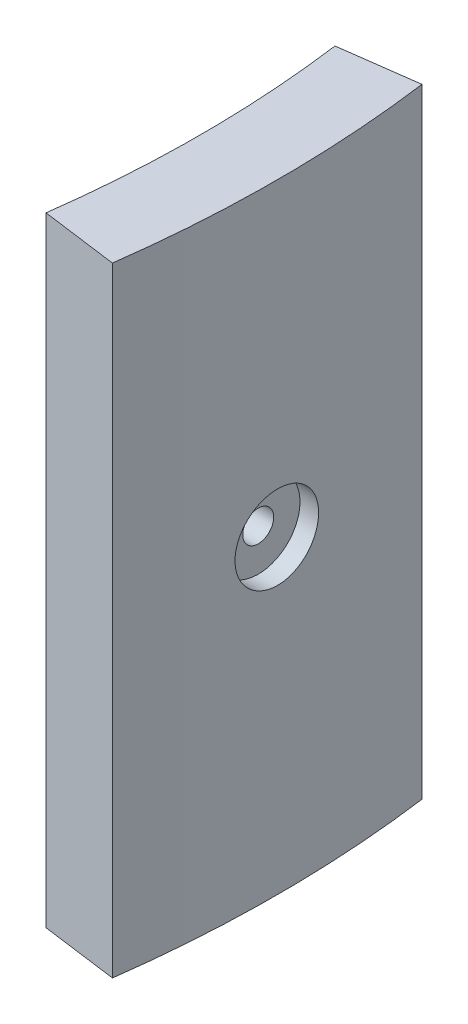
ISO-10303-21;
HEADER;
FILE_DESCRIPTION(('STEP AP214'),'2;1');
FILE_NAME('part.step','',(''),(''),'','','');
FILE_SCHEMA(('AUTOMOTIVE_DESIGN { 1 0 10303 214 1 1 1 1 }'));
ENDSEC;
DATA;
#1=APPLICATION_CONTEXT('core data for automotive mechanical design processes');
#2=APPLICATION_PROTOCOL_DEFINITION('international standard','automotive_design',2000,#1);
#3=PRODUCT_CONTEXT('',#1,'mechanical');
#4=PRODUCT('Part','Part','',(#3));
#5=PRODUCT_RELATED_PRODUCT_CATEGORY('part','',(#4));
#6=PRODUCT_DEFINITION_FORMATION('','',#4);
#7=PRODUCT_DEFINITION_CONTEXT('part definition',#1,'design');
#8=PRODUCT_DEFINITION('design','',#6,#7);
#9=PRODUCT_DEFINITION_SHAPE('','',#8);
#10=(LENGTH_UNIT() NAMED_UNIT(*) SI_UNIT(.MILLI.,.METRE.));
#11=(NAMED_UNIT(*) PLANE_ANGLE_UNIT() SI_UNIT($,.RADIAN.));
#12=(NAMED_UNIT(*) SI_UNIT($,.STERADIAN.) SOLID_ANGLE_UNIT());
#13=UNCERTAINTY_MEASURE_WITH_UNIT(LENGTH_MEASURE(1.E-05),#10,'distance_accuracy_value','');
#14=(GEOMETRIC_REPRESENTATION_CONTEXT(3) GLOBAL_UNCERTAINTY_ASSIGNED_CONTEXT((#13)) GLOBAL_UNIT_ASSIGNED_CONTEXT((#10,
#11,#12)) REPRESENTATION_CONTEXT('',''));
#15=CARTESIAN_POINT('',(0.,0.,0.));
#16=DIRECTION('',(0.,0.,1.));
#17=DIRECTION('',(1.,0.,0.));
#18=AXIS2_PLACEMENT_3D('',#15,#16,#17);
#19=CARTESIAN_POINT('',(0.,25.4,0.));
#20=DIRECTION('',(0.,-1.,0.));
#21=DIRECTION('',(0.,0.,-1.));
#22=AXIS2_PLACEMENT_3D('',#19,#20,#21);
#23=CYLINDRICAL_SURFACE('',#22,95.25);
#24=CARTESIAN_POINT('',(95.1882579891028,0.,-3.42899999999998));
#25=CARTESIAN_POINT('',(95.1882588212864,-0.19254146654496,-3.42899148216093));
#26=CARTESIAN_POINT('',(95.188848458503,-0.385220955411095,-3.41272848972156));
#27=CARTESIAN_POINT('',(95.1911438276907,-0.765268845430857,-3.34808043862594));
#28=CARTESIAN_POINT('',(95.192850888321,-0.952630646592135,-3.29965713912596));
#29=CARTESIAN_POINT('',(95.1971874817274,-1.31648251758568,-3.17207288255785));
#30=CARTESIAN_POINT('',(95.1998165584651,-1.49297791141046,-3.09292711906003));
#31=CARTESIAN_POINT('',(95.2057003587669,-1.83012854070572,-2.90616677144066));
#32=CARTESIAN_POINT('',(95.2089549308016,-1.99078759837347,-2.7985590799888));
#33=CARTESIAN_POINT('',(95.2157252350068,-2.29184947455029,-2.55785611201751));
#34=CARTESIAN_POINT('',(95.2192410994052,-2.43224192986704,-2.42474787634796));
#35=CARTESIAN_POINT('',(95.226136525718,-2.68869770492173,-2.13684628106697));
#36=CARTESIAN_POINT('',(95.2295160821666,-2.80476004985339,-1.98205205300243));
#37=CARTESIAN_POINT('',(95.2357587724735,-3.00928238846977,-1.65512742119874));
#38=CARTESIAN_POINT('',(95.2386217754457,-3.09773539053521,-1.48299264081912));
#39=CARTESIAN_POINT('',(95.2435074911883,-3.24448298658828,-1.12630421022706));
#40=CARTESIAN_POINT('',(95.2455302080668,-3.30277772801287,-0.941750620732364));
#41=CARTESIAN_POINT('',(95.2485065711235,-3.38752962031386,-0.565548816026755));
#42=CARTESIAN_POINT('',(95.2494606843165,-3.41400067955394,-0.373903737888003));
#43=CARTESIAN_POINT('',(95.2501938619344,-3.43439666878455,0.0111121182592877));
#44=CARTESIAN_POINT('',(95.2499729321762,-3.42832175989221,0.204482887720148));
#45=CARTESIAN_POINT('',(95.2483813231724,-3.38380991868195,0.587366846464422));
#46=CARTESIAN_POINT('',(95.247011176687,-3.34538798194635,0.77688178156659));
#47=CARTESIAN_POINT('',(95.2432761448675,-3.23729595728398,1.14676999466537));
#48=CARTESIAN_POINT('',(95.2409112568527,-3.16762578514539,1.32714324802434));
#49=CARTESIAN_POINT('',(95.2354523223161,-2.99899779081093,1.67367625247095));
#50=CARTESIAN_POINT('',(95.2323581049782,-2.90003310616142,1.83983266138932));
#51=CARTESIAN_POINT('',(95.2257891598066,-2.67563039833528,2.15317879421984));
#52=CARTESIAN_POINT('',(95.2223144306534,-2.55019228334164,2.30036845234731));
#53=CARTESIAN_POINT('',(95.215373654667,-2.27631859270215,2.57169032964415));
#54=CARTESIAN_POINT('',(95.2119076138795,-2.1278700074427,2.69580941737769));
#55=CARTESIAN_POINT('',(95.2053769600225,-1.81223512578617,2.91736575707606));
#56=CARTESIAN_POINT('',(95.2023123470272,-1.64504882592643,3.0148030041102));
#57=CARTESIAN_POINT('',(95.1969302609223,-1.29667680365366,3.18022841794688));
#58=CARTESIAN_POINT('',(95.194612799043,-1.11549087086471,3.24821614210274));
#59=CARTESIAN_POINT('',(95.190986794021,-0.74426619851361,3.35280405502591));
#60=CARTESIAN_POINT('',(95.1896782469334,-0.554227493568799,3.38940436651774));
#61=CARTESIAN_POINT('',(95.1882183420505,-0.170806069671059,3.43016236046597));
#62=CARTESIAN_POINT('',(95.1880663350518,0.0225747121515609,3.43433824382603));
#63=CARTESIAN_POINT('',(95.1889349567122,0.407291297602726,3.41017629072342));
#64=CARTESIAN_POINT('',(95.18995558339,0.598627104685815,3.38183850919434));
#65=CARTESIAN_POINT('',(95.1930538305445,0.973771540011289,3.29346871254224));
#66=CARTESIAN_POINT('',(95.1951311746759,1.15758212262534,3.23344498354974));
#67=CARTESIAN_POINT('',(95.2001084536525,1.51251845242875,3.08341554357114));
#68=CARTESIAN_POINT('',(95.2030083909245,1.68364416219201,2.99340974412873));
#69=CARTESIAN_POINT('',(95.2093055456925,2.00843692286122,2.78592423729151));
#70=CARTESIAN_POINT('',(95.2127029846757,2.16209614330582,2.6684322791009));
#71=CARTESIAN_POINT('',(95.2196113812853,2.44751541800368,2.4093275866119));
#72=CARTESIAN_POINT('',(95.2231223393093,2.57927539559654,2.26771476787964));
#73=CARTESIAN_POINT('',(95.2298638922164,2.817216849249,1.96431021537576));
#74=CARTESIAN_POINT('',(95.2330943579742,2.92338658427716,1.80250927058396));
#75=CARTESIAN_POINT('',(95.2389089494327,3.1070535260247,1.46336826479054));
#76=CARTESIAN_POINT('',(95.2414930769275,3.18455081232702,1.28602824692069));
#77=CARTESIAN_POINT('',(95.2457230925831,3.30865240308176,0.920887248901641));
#78=CARTESIAN_POINT('',(95.2473692110075,3.35526428977975,0.733088848526373));
#79=CARTESIAN_POINT('',(95.249538573662,3.41629679458634,0.352325579560826));
#80=CARTESIAN_POINT('',(95.2500618201989,3.43071747883285,0.159360721586035));
#81=CARTESIAN_POINT('',(95.249926474883,3.42695737694816,-0.226140839112787));
#82=CARTESIAN_POINT('',(95.2492685525694,3.40879506032282,-0.418677722494774));
#83=CARTESIAN_POINT('',(95.2468463017756,3.34042256827235,-0.797967419631828));
#84=CARTESIAN_POINT('',(95.2450819711264,3.29021233001951,-0.984720222046859));
#85=CARTESIAN_POINT('',(95.2406455752255,3.15917235862646,-1.34714622736192));
#86=CARTESIAN_POINT('',(95.2379734962763,3.07834216344404,-1.52281926302629));
#87=CARTESIAN_POINT('',(95.2320225400387,2.8883616214404,-1.85809924287067));
#88=CARTESIAN_POINT('',(95.2287436838719,2.77921226034208,-2.01770674598536));
#89=CARTESIAN_POINT('',(95.2219465295105,2.53563173723256,-2.3164133828354));
#90=CARTESIAN_POINT('',(95.2184281219033,2.40118897262861,-2.4555030521794));
#91=CARTESIAN_POINT('',(95.2115487132322,2.11082182100369,-2.70917724745731));
#92=CARTESIAN_POINT('',(95.2081877512969,1.95489213157318,-2.82375570679802));
#93=CARTESIAN_POINT('',(95.2020008345523,1.62590125636186,-3.02518289403791));
#94=CARTESIAN_POINT('',(95.1991752692038,1.45282773803301,-3.11201146727046));
#95=CARTESIAN_POINT('',(95.1943846040811,1.09468186606166,-3.25527672831563));
#96=CARTESIAN_POINT('',(95.1924184811499,0.909624082705514,-3.31174957280501));
#97=CARTESIAN_POINT('',(95.1900927467371,0.602834998751929,-3.37777223230287));
#98=CARTESIAN_POINT('',(95.1894077129529,0.483094015778267,-3.39695838595895));
#99=CARTESIAN_POINT('',(95.1884900724128,0.242253570931636,-3.42257494693515));
#100=CARTESIAN_POINT('',(95.1882574654626,0.121154109642256,-3.42900535973483));
#101=CARTESIAN_POINT('',(95.1882579891028,0.,-3.42899999999998));
#102=B_SPLINE_CURVE_WITH_KNOTS('',3,(#24,#25,#26,#27,#28,#29,#30,#31,#32,#33,#34,#35,#36,#37,
#38,#39,#40,#41,#42,#43,#44,#45,#46,#47,#48,#49,#50,#51,#52,#53,#54,#55,#56,#57,#58,#59,#60,#61,
#62,#63,#64,#65,#66,#67,#68,#69,#70,#71,#72,#73,#74,#75,#76,#77,#78,#79,#80,#81,#82,#83,#84,#85,
#86,#87,#88,#89,#90,#91,#92,#93,#94,#95,#96,#97,#98,#99,#100,#101),.UNSPECIFIED.,.T.,.F.,(4,2,2,
2,2,2,2,2,2,2,2,2,2,2,2,2,2,2,2,2,2,2,2,2,2,2,2,2,2,2,2,2,2,2,2,2,2,2,4),(0.,0.577182163774471,
1.15505186901033,1.73263615634625,2.31008069705519,2.88781947213913,3.46558139038919,
4.04348949901812,4.62139478235752,5.19904740347478,5.77669716495511,6.35407928429476,
6.93146295964818,7.50898199853117,8.08650304043928,8.66435179907708,9.24220066449885,
9.8200582150868,10.3979135062461,10.9754444046565,11.5529743272988,12.1303532959762,
12.707733968114,13.2853724752816,13.8630130044855,14.4409180579704,15.018821507416,
15.5965830311946,16.1743433679416,16.7517763076969,17.3292103794723,17.906653164831,
18.4840758534739,19.0617640662151,19.6395950934091,20.2178448489555,20.7954043169852,
21.1585885310019,21.5217725890041),.UNSPECIFIED.);
#103=CARTESIAN_POINT('',(95.1882579891028,0.,-3.42899999999998));
#104=VERTEX_POINT('',#103);
#105=EDGE_CURVE('E11',#104,#104,#102,.T.);
#106=ORIENTED_EDGE('',*,*,#105,.T.);
#107=EDGE_LOOP('',(#106));
#108=FACE_BOUND('',#107,.T.);
#109=CARTESIAN_POINT('',(0.,-25.4,0.));
#110=DIRECTION('',(0.,1.,0.));
#111=DIRECTION('',(0.,0.,1.));
#112=AXIS2_PLACEMENT_3D('',#109,#110,#111);
#113=CIRCLE('',#112,95.25);
#114=CARTESIAN_POINT('',(94.3995365454725,-25.4,12.7));
#115=VERTEX_POINT('',#114);
#116=CARTESIAN_POINT('',(94.3995365454725,-25.4,-12.7));
#117=VERTEX_POINT('',#116);
#118=EDGE_CURVE('E134',#115,#117,#113,.T.);
#119=ORIENTED_EDGE('',*,*,#118,.T.);
#120=DIRECTION('',(0.,-1.,0.));
#121=VECTOR('',#120,1.);
#122=CARTESIAN_POINT('',(94.3995365454725,25.4,-12.7));
#123=LINE('',#122,#121);
#124=CARTESIAN_POINT('',(94.3995365454725,25.4,-12.7));
#125=VERTEX_POINT('',#124);
#126=EDGE_CURVE('E64',#125,#117,#123,.T.);
#127=ORIENTED_EDGE('',*,*,#126,.F.);
#128=CARTESIAN_POINT('',(0.,25.4,0.));
#129=DIRECTION('',(0.,1.,0.));
#130=DIRECTION('',(0.,0.,1.));
#131=AXIS2_PLACEMENT_3D('',#128,#129,#130);
#132=CIRCLE('',#131,95.25);
#133=CARTESIAN_POINT('',(94.3995365454725,25.4,12.7));
#134=VERTEX_POINT('',#133);
#135=EDGE_CURVE('E116',#134,#125,#132,.T.);
#136=ORIENTED_EDGE('',*,*,#135,.F.);
#137=DIRECTION('',(0.,-1.,0.));
#138=VECTOR('',#137,1.);
#139=CARTESIAN_POINT('',(94.3995365454725,25.4,12.7));
#140=LINE('',#139,#138);
#141=EDGE_CURVE('E130',#134,#115,#140,.T.);
#142=ORIENTED_EDGE('',*,*,#141,.T.);
#143=EDGE_LOOP('',(#119,#127,#136,#142));
#144=FACE_BOUND('',#143,.T.);
#145=ADVANCED_FACE('F48',(#108,#144),#23,.T.);
#146=CARTESIAN_POINT('',(94.3995365454725,25.4,-12.7));
#147=DIRECTION('',(0.133333333333333,0.,0.991071249821234));
#148=DIRECTION('',(0.991071249821234,0.,-0.133333333333333));
#149=AXIS2_PLACEMENT_3D('',#146,#147,#148);
#150=PLANE('',#149);
#151=DIRECTION('',(-0.991071249821234,0.,0.133333333333333));
#152=VECTOR('',#151,1.);
#153=CARTESIAN_POINT('',(94.3995365454725,-25.4,-12.7));
#154=LINE('',#153,#152);
#155=CARTESIAN_POINT('',(88.1062341091077,-25.4,-11.8533333333333));
#156=VERTEX_POINT('',#155);
#157=EDGE_CURVE('E122',#117,#156,#154,.T.);
#158=ORIENTED_EDGE('',*,*,#157,.T.);
#159=DIRECTION('',(0.,-1.,0.));
#160=VECTOR('',#159,1.);
#161=CARTESIAN_POINT('',(88.1062341091077,25.4,-11.8533333333333));
#162=LINE('',#161,#160);
#163=CARTESIAN_POINT('',(88.1062341091077,25.4,-11.8533333333333));
#164=VERTEX_POINT('',#163);
#165=EDGE_CURVE('E120',#164,#156,#162,.T.);
#166=ORIENTED_EDGE('',*,*,#165,.F.);
#167=DIRECTION('',(-0.991071249821234,0.,0.133333333333333));
#168=VECTOR('',#167,1.);
#169=CARTESIAN_POINT('',(94.3995365454725,25.4,-12.7));
#170=LINE('',#169,#168);
#171=EDGE_CURVE('E111',#125,#164,#170,.T.);
#172=ORIENTED_EDGE('',*,*,#171,.F.);
#173=ORIENTED_EDGE('',*,*,#126,.T.);
#174=EDGE_LOOP('',(#158,#166,#172,#173));
#175=FACE_BOUND('',#174,.T.);
#176=ADVANCED_FACE('F121',(#175),#150,.F.);
#177=CARTESIAN_POINT('',(0.,25.4,0.));
#178=DIRECTION('',(0.,-1.,0.));
#179=DIRECTION('',(0.,0.,-1.));
#180=AXIS2_PLACEMENT_3D('',#177,#178,#179);
#181=CYLINDRICAL_SURFACE('',#180,88.9);
#182=CARTESIAN_POINT('',(88.8909281085533,0.,-1.26999999999999));
#183=CARTESIAN_POINT('',(88.8909282311842,0.0713325523193906,-1.26999683794683));
#184=CARTESIAN_POINT('',(88.8910148943041,0.142716734825299,-1.263969990563));
#185=CARTESIAN_POINT('',(88.8913522763715,0.283518874338756,-1.24001148421466));
#186=CARTESIAN_POINT('',(88.89160319244,0.352934364140567,-1.22206552066713));
#187=CARTESIAN_POINT('',(88.8922406503574,0.487738890234697,-1.17478000684787));
#188=CARTESIAN_POINT('',(88.8926271270613,0.553129842844625,-1.14544592851806));
#189=CARTESIAN_POINT('',(88.8934920742722,0.678040603176611,-1.07622446394339));
#190=CARTESIAN_POINT('',(88.893970521991,0.7375618597513,-1.03633969098643));
#191=CARTESIAN_POINT('',(88.894965625433,0.849074971671301,-0.947137953259547));
#192=CARTESIAN_POINT('',(88.8954822875766,0.901065557451525,-0.897819401331936));
#193=CARTESIAN_POINT('',(88.8964955288856,0.9960311414042,-0.791151917313039));
#194=CARTESIAN_POINT('',(88.8969921072592,1.03900578439919,-0.733802669005807));
#195=CARTESIAN_POINT('',(88.8979091885998,1.11471815438981,-0.612701395410132));
#196=CARTESIAN_POINT('',(88.8983296897329,1.14745563462564,-0.548949215832342));
#197=CARTESIAN_POINT('',(88.8990471922903,1.20176256026659,-0.416852975502548));
#198=CARTESIAN_POINT('',(88.8993441940187,1.22333203318567,-0.348508926063732));
#199=CARTESIAN_POINT('',(88.8997811974641,1.25468935007485,-0.20917380105538));
#200=CARTESIAN_POINT('',(88.8999212097451,1.264477986798,-0.138182903928328));
#201=CARTESIAN_POINT('',(88.9000284848545,1.27199819131443,0.00443464088106059));
#202=CARTESIAN_POINT('',(88.8999957480799,1.26972978681723,0.0760612871019392));
#203=CARTESIAN_POINT('',(88.899761225542,1.2532010246084,0.21791170619071));
#204=CARTESIAN_POINT('',(88.8995594520612,1.23894153820394,0.28813558060857));
#205=CARTESIAN_POINT('',(88.8990096166028,1.19883672568182,0.42519263005341));
#206=CARTESIAN_POINT('',(88.8986615544326,1.17299138432105,0.492025800619229));
#207=CARTESIAN_POINT('',(88.8978583588592,1.11044753038679,0.620406994117164));
#208=CARTESIAN_POINT('',(88.8974032215179,1.07374861862275,0.681954822548767));
#209=CARTESIAN_POINT('',(88.8964371843748,0.990539702669437,0.798016030737469));
#210=CARTESIAN_POINT('',(88.8959262845616,0.944029696464674,0.852529409049471));
#211=CARTESIAN_POINT('',(88.8949062631897,0.842513899839185,0.952979377566059));
#212=CARTESIAN_POINT('',(88.8943971417942,0.787507349641388,0.998915199937107));
#213=CARTESIAN_POINT('',(88.8934381226261,0.670562608723525,1.08090017564647));
#214=CARTESIAN_POINT('',(88.8929882248616,0.608624417054158,1.11694932763079));
#215=CARTESIAN_POINT('',(88.8921983803891,0.479574215464966,1.1781375413534));
#216=CARTESIAN_POINT('',(88.8918584339108,0.412462194738081,1.203276580302));
#217=CARTESIAN_POINT('',(88.8913268298199,0.274969627907211,1.24193046394083));
#218=CARTESIAN_POINT('',(88.8911351721108,0.204589083934831,1.2554453162118));
#219=CARTESIAN_POINT('',(88.8909217706032,0.0625640232488068,1.27046624545495));
#220=CARTESIAN_POINT('',(88.8909000117829,-0.00908038115702448,1.27197338411012));
#221=CARTESIAN_POINT('',(88.891028822061,-0.15160525662489,1.26293886798279));
#222=CARTESIAN_POINT('',(88.8911793911202,-0.222485727860834,1.25239721594327));
#223=CARTESIAN_POINT('',(88.8916358684332,-0.361467705483369,1.21956524082944));
#224=CARTESIAN_POINT('',(88.8919417703327,-0.429569325423476,1.19727539834606));
#225=CARTESIAN_POINT('',(88.8926744206003,-0.561063881560353,1.14158027253684));
#226=CARTESIAN_POINT('',(88.8931011690115,-0.624456816079014,1.10817498524963));
#227=CARTESIAN_POINT('',(88.8940274376064,-0.74473936669317,1.03119450436814));
#228=CARTESIAN_POINT('',(88.8945269629042,-0.801628525253899,0.987618595934928));
#229=CARTESIAN_POINT('',(88.8955424509047,-0.907284042072951,0.891534893600314));
#230=CARTESIAN_POINT('',(88.8960584136219,-0.956050393093833,0.839027091740661));
#231=CARTESIAN_POINT('',(88.8970486506094,-1.04407949122227,0.726565590246442));
#232=CARTESIAN_POINT('',(88.897522921867,-1.08334155190297,0.666611353282037));
#233=CARTESIAN_POINT('',(88.8983762640337,-1.15124282135365,0.540961699910761));
#234=CARTESIAN_POINT('',(88.8987553350694,-1.17988204423111,0.475266291128494));
#235=CARTESIAN_POINT('',(88.8993755269184,-1.22572349621534,0.340001753002647));
#236=CARTESIAN_POINT('',(88.8996166531451,-1.24292617413261,0.27043277578773));
#237=CARTESIAN_POINT('',(88.8999337928664,-1.2654076959106,0.129393682058773));
#238=CARTESIAN_POINT('',(88.9000098061637,-1.27068652552186,0.0579235632728967));
#239=CARTESIAN_POINT('',(88.8999881500946,-1.26917040853503,-0.0848819490579385));
#240=CARTESIAN_POINT('',(88.8998904965032,-1.26237655856184,-0.156217354250431));
#241=CARTESIAN_POINT('',(88.8995325455846,-1.236910159501,-0.2967350725172));
#242=CARTESIAN_POINT('',(88.8992722479313,-1.21823758659452,-0.365917381273865));
#243=CARTESIAN_POINT('',(88.8986183442611,-1.16954360796397,-0.500166313824704));
#244=CARTESIAN_POINT('',(88.8982247357915,-1.13952199342912,-0.565232861867366));
#245=CARTESIAN_POINT('',(88.8973485964821,-1.06898350791916,-0.689399933227708));
#246=CARTESIAN_POINT('',(88.8968660690715,-1.02846704164986,-0.748500686478162));
#247=CARTESIAN_POINT('',(88.8958664730269,-0.938089539360459,-0.859061198388966));
#248=CARTESIAN_POINT('',(88.8953494049319,-0.888228649131647,-0.910521076239467));
#249=CARTESIAN_POINT('',(88.8943388729967,-0.780560720177592,-1.00435282059557));
#250=CARTESIAN_POINT('',(88.8938454150502,-0.72275171121797,-1.04672242705342));
#251=CARTESIAN_POINT('',(88.8929376441693,-0.600815644272677,-1.12117274089571));
#252=CARTESIAN_POINT('',(88.8925233722064,-0.536685341465751,-1.15324812776205));
#253=CARTESIAN_POINT('',(88.8918215176229,-0.403999462644137,-1.20613995390038));
#254=CARTESIAN_POINT('',(88.8915337833838,-0.335449296143412,-1.22696987441947));
#255=CARTESIAN_POINT('',(88.8911946798608,-0.222052601880299,-1.2512349854161));
#256=CARTESIAN_POINT('',(88.8910951470877,-0.177942725751249,-1.25826306740325));
#257=CARTESIAN_POINT('',(88.8909618230782,-0.0892286349511786,-1.267646563605));
#258=CARTESIAN_POINT('',(88.8909280318376,-0.0446244203125899,-1.27000197812616));
#259=CARTESIAN_POINT('',(88.8909281085533,0.,-1.26999999999999));
#260=B_SPLINE_CURVE_WITH_KNOTS('',3,(#182,#183,#184,#185,#186,#187,#188,#189,#190,#191,#192,
#193,#194,#195,#196,#197,#198,#199,#200,#201,#202,#203,#204,#205,#206,#207,#208,#209,#210,#211,
#212,#213,#214,#215,#216,#217,#218,#219,#220,#221,#222,#223,#224,#225,#226,#227,#228,#229,#230,
#231,#232,#233,#234,#235,#236,#237,#238,#239,#240,#241,#242,#243,#244,#245,#246,#247,#248,#249,
#250,#251,#252,#253,#254,#255,#256,#257,#258,#259),.UNSPECIFIED.,.T.,.F.,(4,2,2,2,2,2,2,2,2,2,2,
2,2,2,2,2,2,2,2,2,2,2,2,2,2,2,2,2,2,2,2,2,2,2,2,2,2,2,4),(0.,0.213834776605687,
0.427926649281697,0.641915778768605,0.855851955112907,1.06982415621188,1.28380478503055,
1.49779057130837,1.71177583039953,1.92574668924339,2.13971705633906,2.3536718770636,
2.56762697928184,2.78158995167358,2.99555296801995,3.2095351284331,3.42351731815156,
3.63749995484669,3.85148245199253,4.06544602929196,4.27940955788133,4.49336433440385,
4.70731918717645,4.92128908222982,5.13525916792986,5.34924470255011,5.56322995298966,
5.77720680539502,5.99118391351092,6.20514158595575,6.41909968742297,6.63306172569256,
6.84701551431792,7.06096596512363,7.27496954738278,7.48908355890824,7.70294031387245,
7.83671168843381,7.97048305421889),.UNSPECIFIED.);
#261=CARTESIAN_POINT('',(88.8909281085533,0.,-1.26999999999999));
#262=VERTEX_POINT('',#261);
#263=EDGE_CURVE('E52',#262,#262,#260,.T.);
#264=ORIENTED_EDGE('',*,*,#263,.T.);
#265=EDGE_LOOP('',(#264));
#266=FACE_BOUND('',#265,.T.);
#267=CARTESIAN_POINT('',(0.,-25.4,0.));
#268=DIRECTION('',(0.,-1.,0.));
#269=DIRECTION('',(0.,0.,1.));
#270=AXIS2_PLACEMENT_3D('',#267,#268,#269);
#271=CIRCLE('',#270,88.9);
#272=CARTESIAN_POINT('',(88.1062341091077,-25.4,11.8533333333333));
#273=VERTEX_POINT('',#272);
#274=EDGE_CURVE('E97',#156,#273,#271,.T.);
#275=ORIENTED_EDGE('',*,*,#274,.T.);
#276=DIRECTION('',(0.,-1.,0.));
#277=VECTOR('',#276,1.);
#278=CARTESIAN_POINT('',(88.1062341091077,25.4,11.8533333333333));
#279=LINE('',#278,#277);
#280=CARTESIAN_POINT('',(88.1062341091077,25.4,11.8533333333333));
#281=VERTEX_POINT('',#280);
#282=EDGE_CURVE('E124',#281,#273,#279,.T.);
#283=ORIENTED_EDGE('',*,*,#282,.F.);
#284=CARTESIAN_POINT('',(0.,25.4,0.));
#285=DIRECTION('',(0.,-1.,0.));
#286=DIRECTION('',(0.,0.,1.));
#287=AXIS2_PLACEMENT_3D('',#284,#285,#286);
#288=CIRCLE('',#287,88.9);
#289=EDGE_CURVE('E114',#164,#281,#288,.T.);
#290=ORIENTED_EDGE('',*,*,#289,.F.);
#291=ORIENTED_EDGE('',*,*,#165,.T.);
#292=EDGE_LOOP('',(#275,#283,#290,#291));
#293=FACE_BOUND('',#292,.T.);
#294=ADVANCED_FACE('F126',(#266,#293),#181,.F.);
#295=CARTESIAN_POINT('',(94.3995365454725,25.4,12.7));
#296=DIRECTION('',(0.133333333333333,0.,-0.991071249821234));
#297=DIRECTION('',(-0.991071249821234,0.,-0.133333333333333));
#298=AXIS2_PLACEMENT_3D('',#295,#296,#297);
#299=PLANE('',#298);
#300=DIRECTION('',(0.991071249821234,0.,0.133333333333333));
#301=VECTOR('',#300,1.);
#302=CARTESIAN_POINT('',(94.3995365454725,-25.4,12.7));
#303=LINE('',#302,#301);
#304=EDGE_CURVE('E103',#273,#115,#303,.T.);
#305=ORIENTED_EDGE('',*,*,#304,.T.);
#306=ORIENTED_EDGE('',*,*,#141,.F.);
#307=DIRECTION('',(0.991071249821234,0.,0.133333333333333));
#308=VECTOR('',#307,1.);
#309=CARTESIAN_POINT('',(94.3995365454725,25.4,12.7));
#310=LINE('',#309,#308);
#311=EDGE_CURVE('E75',#281,#134,#310,.T.);
#312=ORIENTED_EDGE('',*,*,#311,.F.);
#313=ORIENTED_EDGE('',*,*,#282,.T.);
#314=EDGE_LOOP('',(#305,#306,#312,#313));
#315=FACE_BOUND('',#314,.T.);
#316=ADVANCED_FACE('F164',(#315),#299,.F.);
#317=CARTESIAN_POINT('',(0.,25.4,0.));
#318=DIRECTION('',(0.,1.,0.));
#319=DIRECTION('',(0.,0.,1.));
#320=AXIS2_PLACEMENT_3D('',#317,#318,#319);
#321=PLANE('',#320);
#322=ORIENTED_EDGE('',*,*,#135,.T.);
#323=ORIENTED_EDGE('',*,*,#171,.T.);
#324=ORIENTED_EDGE('',*,*,#289,.T.);
#325=ORIENTED_EDGE('',*,*,#311,.T.);
#326=EDGE_LOOP('',(#322,#323,#324,#325));
#327=FACE_BOUND('',#326,.T.);
#328=ADVANCED_FACE('F112',(#327),#321,.T.);
#329=CARTESIAN_POINT('',(0.,-25.4,0.));
#330=DIRECTION('',(0.,1.,0.));
#331=DIRECTION('',(0.,0.,1.));
#332=AXIS2_PLACEMENT_3D('',#329,#330,#331);
#333=PLANE('',#332);
#334=ORIENTED_EDGE('',*,*,#118,.F.);
#335=ORIENTED_EDGE('',*,*,#304,.F.);
#336=ORIENTED_EDGE('',*,*,#274,.F.);
#337=ORIENTED_EDGE('',*,*,#157,.F.);
#338=EDGE_LOOP('',(#334,#335,#336,#337));
#339=FACE_BOUND('',#338,.T.);
#340=ADVANCED_FACE('F160',(#339),#333,.F.);
#341=CARTESIAN_POINT('',(93.6625,0.,0.));
#342=DIRECTION('',(1.,0.,0.));
#343=DIRECTION('',(0.,0.,-1.));
#344=AXIS2_PLACEMENT_3D('',#341,#342,#343);
#345=CYLINDRICAL_SURFACE('',#344,3.429);
#346=CARTESIAN_POINT('',(93.6625,0.,0.));
#347=DIRECTION('',(1.,0.,0.));
#348=DIRECTION('',(0.,0.,-1.));
#349=AXIS2_PLACEMENT_3D('',#346,#347,#348);
#350=CIRCLE('',#349,3.429);
#351=CARTESIAN_POINT('',(93.6625,0.,-3.42899999999998));
#352=VERTEX_POINT('',#351);
#353=EDGE_CURVE('E138',#352,#352,#350,.T.);
#354=ORIENTED_EDGE('',*,*,#353,.F.);
#355=EDGE_LOOP('',(#354));
#356=FACE_BOUND('',#355,.T.);
#357=ORIENTED_EDGE('',*,*,#105,.F.);
#358=EDGE_LOOP('',(#357));
#359=FACE_BOUND('',#358,.T.);
#360=ADVANCED_FACE('F154',(#356,#359),#345,.F.);
#361=CARTESIAN_POINT('',(93.6625,0.,0.));
#362=DIRECTION('',(1.,0.,0.));
#363=DIRECTION('',(0.,0.,-1.));
#364=AXIS2_PLACEMENT_3D('',#361,#362,#363);
#365=PLANE('',#364);
#366=CARTESIAN_POINT('',(93.6625,0.,0.));
#367=DIRECTION('',(1.,0.,0.));
#368=DIRECTION('',(0.,0.,-1.));
#369=AXIS2_PLACEMENT_3D('',#366,#367,#368);
#370=CIRCLE('',#369,1.27);
#371=CARTESIAN_POINT('',(93.6625,0.,-1.26999999999999));
#372=VERTEX_POINT('',#371);
#373=EDGE_CURVE('E185',#372,#372,#370,.T.);
#374=ORIENTED_EDGE('',*,*,#373,.F.);
#375=EDGE_LOOP('',(#374));
#376=FACE_BOUND('',#375,.T.);
#377=ORIENTED_EDGE('',*,*,#353,.T.);
#378=EDGE_LOOP('',(#377));
#379=FACE_BOUND('',#378,.T.);
#380=ADVANCED_FACE('F159',(#376,#379),#365,.T.);
#381=CARTESIAN_POINT('',(88.1062341091077,0.,0.));
#382=DIRECTION('',(1.,0.,0.));
#383=DIRECTION('',(0.,0.,-1.));
#384=AXIS2_PLACEMENT_3D('',#381,#382,#383);
#385=CYLINDRICAL_SURFACE('',#384,1.27);
#386=ORIENTED_EDGE('',*,*,#373,.T.);
#387=EDGE_LOOP('',(#386));
#388=FACE_BOUND('',#387,.T.);
#389=ORIENTED_EDGE('',*,*,#263,.F.);
#390=EDGE_LOOP('',(#389));
#391=FACE_BOUND('',#390,.T.);
#392=ADVANCED_FACE('F194',(#388,#391),#385,.F.);
#393=CLOSED_SHELL('',(#145,#176,#294,#316,#328,#340,#360,#380,#392));
#394=MANIFOLD_SOLID_BREP('B2',#393);
#395=ADVANCED_BREP_SHAPE_REPRESENTATION('',(#18,#394),#14);
#396=SHAPE_DEFINITION_REPRESENTATION(#9,#395);
ENDSEC;
END-ISO-10303-21;
